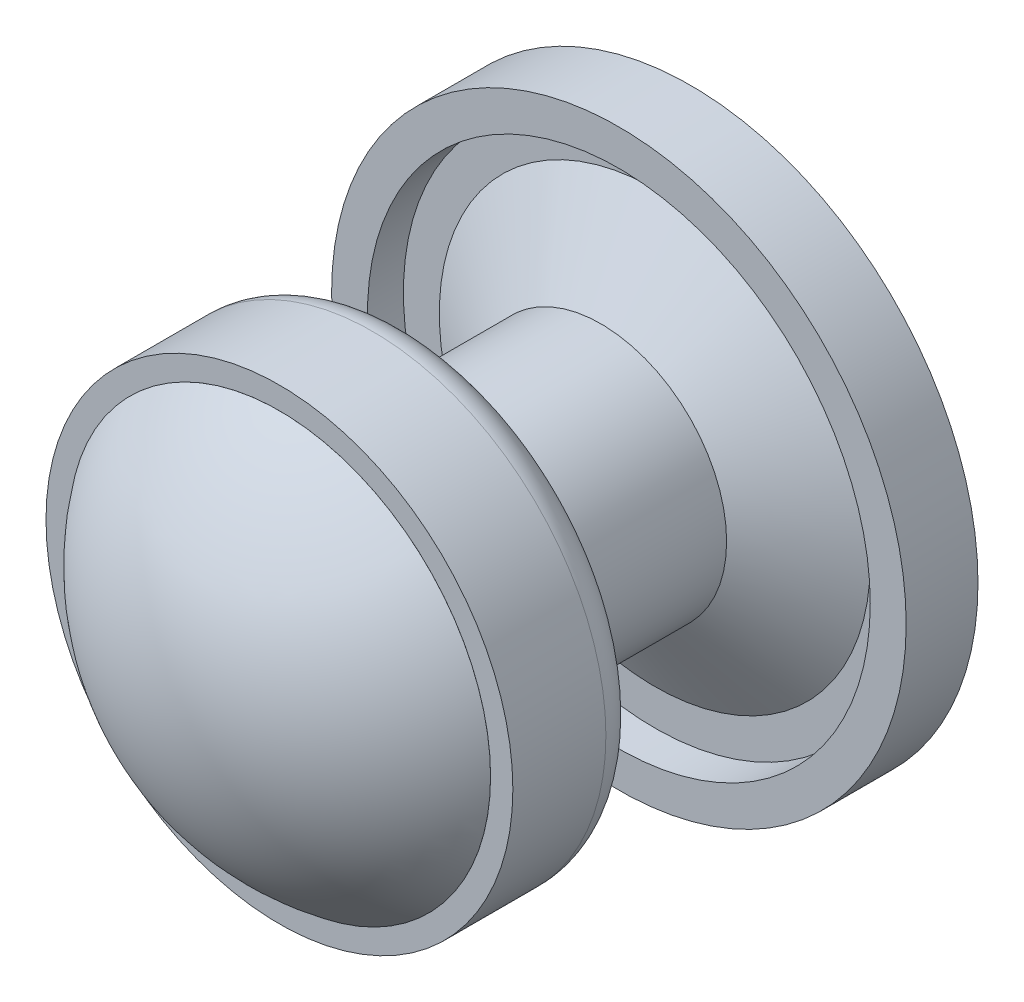
ISO-10303-21;
HEADER;
FILE_DESCRIPTION(('STEP AP214'),'2;1');
FILE_NAME('part.step','',(''),(''),'','','');
FILE_SCHEMA(('AUTOMOTIVE_DESIGN { 1 0 10303 214 1 1 1 1 }'));
ENDSEC;
DATA;
#1=APPLICATION_CONTEXT('core data for automotive mechanical design processes');
#2=APPLICATION_PROTOCOL_DEFINITION('international standard','automotive_design',2000,#1);
#3=PRODUCT_CONTEXT('',#1,'mechanical');
#4=PRODUCT('Part','Part','',(#3));
#5=PRODUCT_RELATED_PRODUCT_CATEGORY('part','',(#4));
#6=PRODUCT_DEFINITION_FORMATION('','',#4);
#7=PRODUCT_DEFINITION_CONTEXT('part definition',#1,'design');
#8=PRODUCT_DEFINITION('design','',#6,#7);
#9=PRODUCT_DEFINITION_SHAPE('','',#8);
#10=(LENGTH_UNIT() NAMED_UNIT(*) SI_UNIT(.MILLI.,.METRE.));
#11=(NAMED_UNIT(*) PLANE_ANGLE_UNIT() SI_UNIT($,.RADIAN.));
#12=(NAMED_UNIT(*) SI_UNIT($,.STERADIAN.) SOLID_ANGLE_UNIT());
#13=UNCERTAINTY_MEASURE_WITH_UNIT(LENGTH_MEASURE(1.E-05),#10,'distance_accuracy_value','');
#14=(GEOMETRIC_REPRESENTATION_CONTEXT(3) GLOBAL_UNCERTAINTY_ASSIGNED_CONTEXT((#13)) GLOBAL_UNIT_ASSIGNED_CONTEXT((#10,
#11,#12)) REPRESENTATION_CONTEXT('',''));
#15=CARTESIAN_POINT('',(0.,0.,0.));
#16=DIRECTION('',(0.,0.,1.));
#17=DIRECTION('',(1.,0.,0.));
#18=AXIS2_PLACEMENT_3D('',#15,#16,#17);
#19=CARTESIAN_POINT('',(0.,0.,1.));
#20=DIRECTION('',(0.,0.,1.));
#21=DIRECTION('',(1.,0.,0.));
#22=AXIS2_PLACEMENT_3D('',#19,#20,#21);
#23=PLANE('',#22);
#24=CARTESIAN_POINT('',(0.,0.,1.));
#25=DIRECTION('',(0.,0.,1.));
#26=DIRECTION('',(1.,0.,0.));
#27=AXIS2_PLACEMENT_3D('',#24,#25,#26);
#28=CIRCLE('',#27,7.);
#29=CARTESIAN_POINT('',(7.,0.,1.));
#30=VERTEX_POINT('',#29);
#31=EDGE_CURVE('E114',#30,#30,#28,.T.);
#32=ORIENTED_EDGE('',*,*,#31,.T.);
#33=EDGE_LOOP('',(#32));
#34=FACE_BOUND('',#33,.T.);
#35=CARTESIAN_POINT('',(0.,0.,1.));
#36=DIRECTION('',(0.,0.,1.));
#37=DIRECTION('',(1.,0.,0.));
#38=AXIS2_PLACEMENT_3D('',#35,#36,#37);
#39=CIRCLE('',#38,6.);
#40=CARTESIAN_POINT('',(6.,0.,1.));
#41=VERTEX_POINT('',#40);
#42=EDGE_CURVE('E107',#41,#41,#39,.T.);
#43=ORIENTED_EDGE('',*,*,#42,.F.);
#44=EDGE_LOOP('',(#43));
#45=FACE_BOUND('',#44,.T.);
#46=ADVANCED_FACE('F38',(#34,#45),#23,.T.);
#47=CARTESIAN_POINT('',(0.,0.,2.));
#48=DIRECTION('',(0.,0.,-1.));
#49=DIRECTION('',(-1.,0.,0.));
#50=AXIS2_PLACEMENT_3D('',#47,#48,#49);
#51=CYLINDRICAL_SURFACE('',#50,8.);
#52=CARTESIAN_POINT('',(0.,0.,2.));
#53=DIRECTION('',(0.,0.,1.));
#54=DIRECTION('',(1.,0.,0.));
#55=AXIS2_PLACEMENT_3D('',#52,#53,#54);
#56=CIRCLE('',#55,8.);
#57=CARTESIAN_POINT('',(8.,0.,2.));
#58=VERTEX_POINT('',#57);
#59=EDGE_CURVE('E51',#58,#58,#56,.T.);
#60=ORIENTED_EDGE('',*,*,#59,.F.);
#61=EDGE_LOOP('',(#60));
#62=FACE_BOUND('',#61,.T.);
#63=CARTESIAN_POINT('',(0.,0.,0.));
#64=DIRECTION('',(0.,0.,1.));
#65=DIRECTION('',(1.,0.,0.));
#66=AXIS2_PLACEMENT_3D('',#63,#64,#65);
#67=CIRCLE('',#66,8.);
#68=CARTESIAN_POINT('',(8.,0.,0.));
#69=VERTEX_POINT('',#68);
#70=EDGE_CURVE('E117',#69,#69,#67,.T.);
#71=ORIENTED_EDGE('',*,*,#70,.T.);
#72=EDGE_LOOP('',(#71));
#73=FACE_BOUND('',#72,.T.);
#74=ADVANCED_FACE('F124',(#62,#73),#51,.T.);
#75=CARTESIAN_POINT('',(0.,0.,2.));
#76=DIRECTION('',(0.,0.,1.));
#77=DIRECTION('',(1.,0.,0.));
#78=AXIS2_PLACEMENT_3D('',#75,#76,#77);
#79=PLANE('',#78);
#80=CARTESIAN_POINT('',(0.,0.,2.));
#81=DIRECTION('',(0.,0.,1.));
#82=DIRECTION('',(1.,0.,0.));
#83=AXIS2_PLACEMENT_3D('',#80,#81,#82);
#84=CIRCLE('',#83,7.);
#85=CARTESIAN_POINT('',(7.,0.,2.));
#86=VERTEX_POINT('',#85);
#87=EDGE_CURVE('E106',#86,#86,#84,.T.);
#88=ORIENTED_EDGE('',*,*,#87,.F.);
#89=EDGE_LOOP('',(#88));
#90=FACE_BOUND('',#89,.T.);
#91=ORIENTED_EDGE('',*,*,#59,.T.);
#92=EDGE_LOOP('',(#91));
#93=FACE_BOUND('',#92,.T.);
#94=ADVANCED_FACE('F129',(#90,#93),#79,.T.);
#95=CARTESIAN_POINT('',(0.,0.,0.));
#96=DIRECTION('',(0.,0.,1.));
#97=DIRECTION('',(1.,0.,0.));
#98=AXIS2_PLACEMENT_3D('',#95,#96,#97);
#99=PLANE('',#98);
#100=CARTESIAN_POINT('',(0.,0.,0.));
#101=DIRECTION('',(0.,0.,-1.));
#102=DIRECTION('',(-1.,0.,0.));
#103=AXIS2_PLACEMENT_3D('',#100,#101,#102);
#104=CIRCLE('',#103,1.4);
#105=CARTESIAN_POINT('',(-1.4,0.,0.));
#106=VERTEX_POINT('',#105);
#107=EDGE_CURVE('E54',#106,#106,#104,.T.);
#108=ORIENTED_EDGE('',*,*,#107,.F.);
#109=EDGE_LOOP('',(#108));
#110=FACE_BOUND('',#109,.T.);
#111=ORIENTED_EDGE('',*,*,#70,.F.);
#112=EDGE_LOOP('',(#111));
#113=FACE_BOUND('',#112,.T.);
#114=ADVANCED_FACE('F126',(#110,#113),#99,.F.);
#115=CARTESIAN_POINT('',(0.,0.,1.));
#116=DIRECTION('',(0.,0.,1.));
#117=DIRECTION('',(1.,0.,0.));
#118=AXIS2_PLACEMENT_3D('',#115,#116,#117);
#119=CYLINDRICAL_SURFACE('',#118,7.);
#120=ORIENTED_EDGE('',*,*,#31,.F.);
#121=EDGE_LOOP('',(#120));
#122=FACE_BOUND('',#121,.T.);
#123=ORIENTED_EDGE('',*,*,#87,.T.);
#124=EDGE_LOOP('',(#123));
#125=FACE_BOUND('',#124,.T.);
#126=ADVANCED_FACE('F128',(#122,#125),#119,.F.);
#127=CARTESIAN_POINT('',(0.,0.,2.5));
#128=DIRECTION('',(0.,0.,-1.));
#129=DIRECTION('',(-1.,0.,0.));
#130=AXIS2_PLACEMENT_3D('',#127,#128,#129);
#131=CONICAL_SURFACE('',#130,3.5,1.03037682652431);
#132=ORIENTED_EDGE('',*,*,#42,.T.);
#133=EDGE_LOOP('',(#132));
#134=FACE_BOUND('',#133,.T.);
#135=CARTESIAN_POINT('',(0.,0.,2.5));
#136=DIRECTION('',(0.,0.,1.));
#137=DIRECTION('',(1.,0.,0.));
#138=AXIS2_PLACEMENT_3D('',#135,#136,#137);
#139=CIRCLE('',#138,3.5);
#140=CARTESIAN_POINT('',(3.5,0.,2.5));
#141=VERTEX_POINT('',#140);
#142=EDGE_CURVE('E98',#141,#141,#139,.T.);
#143=ORIENTED_EDGE('',*,*,#142,.F.);
#144=EDGE_LOOP('',(#143));
#145=FACE_BOUND('',#144,.T.);
#146=ADVANCED_FACE('F87',(#134,#145),#131,.T.);
#147=CARTESIAN_POINT('',(0.,0.,6.5));
#148=DIRECTION('',(0.,0.,-1.));
#149=DIRECTION('',(-1.,0.,0.));
#150=AXIS2_PLACEMENT_3D('',#147,#148,#149);
#151=CYLINDRICAL_SURFACE('',#150,3.5);
#152=CARTESIAN_POINT('',(0.,0.,6.5));
#153=DIRECTION('',(0.,0.,1.));
#154=DIRECTION('',(1.,0.,0.));
#155=AXIS2_PLACEMENT_3D('',#152,#153,#154);
#156=CIRCLE('',#155,3.5);
#157=CARTESIAN_POINT('',(3.5,0.,6.5));
#158=VERTEX_POINT('',#157);
#159=EDGE_CURVE('E108',#158,#158,#156,.T.);
#160=ORIENTED_EDGE('',*,*,#159,.F.);
#161=EDGE_LOOP('',(#160));
#162=FACE_BOUND('',#161,.T.);
#163=ORIENTED_EDGE('',*,*,#142,.T.);
#164=EDGE_LOOP('',(#163));
#165=FACE_BOUND('',#164,.T.);
#166=ADVANCED_FACE('F80',(#162,#165),#151,.T.);
#167=CARTESIAN_POINT('',(0.,0.,6.5));
#168=DIRECTION('',(0.,0.,1.));
#169=DIRECTION('',(1.,0.,0.));
#170=AXIS2_PLACEMENT_3D('',#167,#168,#169);
#171=CONICAL_SURFACE('',#170,3.5,1.02964672200571);
#172=ORIENTED_EDGE('',*,*,#159,.T.);
#173=EDGE_LOOP('',(#172));
#174=FACE_BOUND('',#173,.T.);
#175=CARTESIAN_POINT('',(0.,0.,7.952));
#176=DIRECTION('',(0.,0.,1.));
#177=DIRECTION('',(1.,0.,0.));
#178=AXIS2_PLACEMENT_3D('',#175,#176,#177);
#179=CIRCLE('',#178,5.916);
#180=CARTESIAN_POINT('',(5.916,0.,7.952));
#181=VERTEX_POINT('',#180);
#182=EDGE_CURVE('E59',#181,#181,#179,.T.);
#183=ORIENTED_EDGE('',*,*,#182,.F.);
#184=EDGE_LOOP('',(#183));
#185=FACE_BOUND('',#184,.T.);
#186=ADVANCED_FACE('F69',(#174,#185),#171,.T.);
#187=CARTESIAN_POINT('',(0.,0.,11.452));
#188=DIRECTION('',(0.,0.,-1.));
#189=DIRECTION('',(-1.,0.,0.));
#190=AXIS2_PLACEMENT_3D('',#187,#188,#189);
#191=CYLINDRICAL_SURFACE('',#190,6.5);
#192=CARTESIAN_POINT('',(0.,0.,8.86136461334275));
#193=DIRECTION('',(0.,0.,1.));
#194=DIRECTION('',(1.,0.,0.));
#195=AXIS2_PLACEMENT_3D('',#192,#193,#194);
#196=CIRCLE('',#195,6.5);
#197=CARTESIAN_POINT('',(6.5,0.,8.86136461334275));
#198=VERTEX_POINT('',#197);
#199=EDGE_CURVE('E46',#198,#198,#196,.T.);
#200=ORIENTED_EDGE('',*,*,#199,.T.);
#201=EDGE_LOOP('',(#200));
#202=FACE_BOUND('',#201,.T.);
#203=CARTESIAN_POINT('',(0.,0.,11.452));
#204=DIRECTION('',(0.,0.,1.));
#205=DIRECTION('',(1.,0.,0.));
#206=AXIS2_PLACEMENT_3D('',#203,#204,#205);
#207=CIRCLE('',#206,6.5);
#208=CARTESIAN_POINT('',(6.5,0.,11.452));
#209=VERTEX_POINT('',#208);
#210=EDGE_CURVE('E56',#209,#209,#207,.T.);
#211=ORIENTED_EDGE('',*,*,#210,.F.);
#212=EDGE_LOOP('',(#211));
#213=FACE_BOUND('',#212,.T.);
#214=ADVANCED_FACE('F79',(#202,#213),#191,.T.);
#215=CARTESIAN_POINT('',(0.,0.,11.452));
#216=DIRECTION('',(0.,0.,1.));
#217=DIRECTION('',(1.,0.,0.));
#218=AXIS2_PLACEMENT_3D('',#215,#216,#217);
#219=PLANE('',#218);
#220=CARTESIAN_POINT('',(0.,0.,11.452));
#221=DIRECTION('',(0.,0.,1.));
#222=DIRECTION('',(1.,0.,0.));
#223=AXIS2_PLACEMENT_3D('',#220,#221,#222);
#224=CIRCLE('',#223,5.88);
#225=CARTESIAN_POINT('',(5.88,0.,11.452));
#226=VERTEX_POINT('',#225);
#227=EDGE_CURVE('E11',#226,#226,#224,.T.);
#228=ORIENTED_EDGE('',*,*,#227,.F.);
#229=EDGE_LOOP('',(#228));
#230=FACE_BOUND('',#229,.T.);
#231=ORIENTED_EDGE('',*,*,#210,.T.);
#232=EDGE_LOOP('',(#231));
#233=FACE_BOUND('',#232,.T.);
#234=ADVANCED_FACE('F173',(#230,#233),#219,.T.);
#235=CARTESIAN_POINT('',(0.,0.,8.86136461334275));
#236=DIRECTION('',(0.,0.,-1.));
#237=DIRECTION('',(-1.,0.,0.));
#238=AXIS2_PLACEMENT_3D('',#235,#236,#237);
#239=TOROIDAL_SURFACE('',#238,5.5,1.);
#240=ORIENTED_EDGE('',*,*,#182,.T.);
#241=EDGE_LOOP('',(#240));
#242=FACE_BOUND('',#241,.T.);
#243=ORIENTED_EDGE('',*,*,#199,.F.);
#244=EDGE_LOOP('',(#243));
#245=FACE_BOUND('',#244,.T.);
#246=ADVANCED_FACE('F157',(#242,#245),#239,.T.);
#247=CARTESIAN_POINT('',(0.,0.,11.453));
#248=DIRECTION('',(0.,0.,-1.));
#249=DIRECTION('',(-1.,0.,0.));
#250=AXIS2_PLACEMENT_3D('',#247,#248,#249);
#251=CYLINDRICAL_SURFACE('',#250,5.88);
#252=CARTESIAN_POINT('',(0.,0.,11.453));
#253=DIRECTION('',(0.,0.,1.));
#254=DIRECTION('',(1.,0.,0.));
#255=AXIS2_PLACEMENT_3D('',#252,#253,#254);
#256=CIRCLE('',#255,5.88);
#257=CARTESIAN_POINT('',(5.88,0.,11.453));
#258=VERTEX_POINT('',#257);
#259=EDGE_CURVE('E42',#258,#258,#256,.T.);
#260=ORIENTED_EDGE('',*,*,#259,.F.);
#261=EDGE_LOOP('',(#260));
#262=FACE_BOUND('',#261,.T.);
#263=ORIENTED_EDGE('',*,*,#227,.T.);
#264=EDGE_LOOP('',(#263));
#265=FACE_BOUND('',#264,.T.);
#266=ADVANCED_FACE('F172',(#262,#265),#251,.T.);
#267=CARTESIAN_POINT('',(0.,0.,7.19060000000001));
#268=DIRECTION('',(0.,0.,1.));
#269=DIRECTION('',(1.,0.,0.));
#270=AXIS2_PLACEMENT_3D('',#267,#268,#269);
#271=SPHERICAL_SURFACE('',#270,7.2624);
#272=ORIENTED_EDGE('',*,*,#259,.T.);
#273=EDGE_LOOP('',(#272));
#274=FACE_BOUND('',#273,.T.);
#275=ADVANCED_FACE('F40',(#274),#271,.T.);
#276=CARTESIAN_POINT('',(0.,0.,6.));
#277=DIRECTION('',(0.,0.,-1.));
#278=DIRECTION('',(-1.,0.,0.));
#279=AXIS2_PLACEMENT_3D('',#276,#277,#278);
#280=CYLINDRICAL_SURFACE('',#279,1.4);
#281=CARTESIAN_POINT('',(0.,0.,6.));
#282=DIRECTION('',(0.,0.,-1.));
#283=DIRECTION('',(-1.,0.,0.));
#284=AXIS2_PLACEMENT_3D('',#281,#282,#283);
#285=CIRCLE('',#284,1.4);
#286=CARTESIAN_POINT('',(-1.4,0.,6.));
#287=VERTEX_POINT('',#286);
#288=EDGE_CURVE('E199',#287,#287,#285,.T.);
#289=ORIENTED_EDGE('',*,*,#288,.F.);
#290=EDGE_LOOP('',(#289));
#291=FACE_BOUND('',#290,.T.);
#292=ORIENTED_EDGE('',*,*,#107,.T.);
#293=EDGE_LOOP('',(#292));
#294=FACE_BOUND('',#293,.T.);
#295=ADVANCED_FACE('F188',(#291,#294),#280,.F.);
#296=CARTESIAN_POINT('',(0.,0.,6.));
#297=DIRECTION('',(0.,0.,-1.));
#298=DIRECTION('',(-1.,0.,0.));
#299=AXIS2_PLACEMENT_3D('',#296,#297,#298);
#300=PLANE('',#299);
#301=ORIENTED_EDGE('',*,*,#288,.T.);
#302=EDGE_LOOP('',(#301));
#303=FACE_BOUND('',#302,.T.);
#304=ADVANCED_FACE('F191',(#303),#300,.T.);
#305=CLOSED_SHELL('',(#46,#74,#94,#114,#126,#146,#166,#186,#214,#234,#246,#266,#275,#295,#304));
#306=MANIFOLD_SOLID_BREP('B2',#305);
#307=ADVANCED_BREP_SHAPE_REPRESENTATION('',(#18,#306),#14);
#308=SHAPE_DEFINITION_REPRESENTATION(#9,#307);
ENDSEC;
END-ISO-10303-21;
